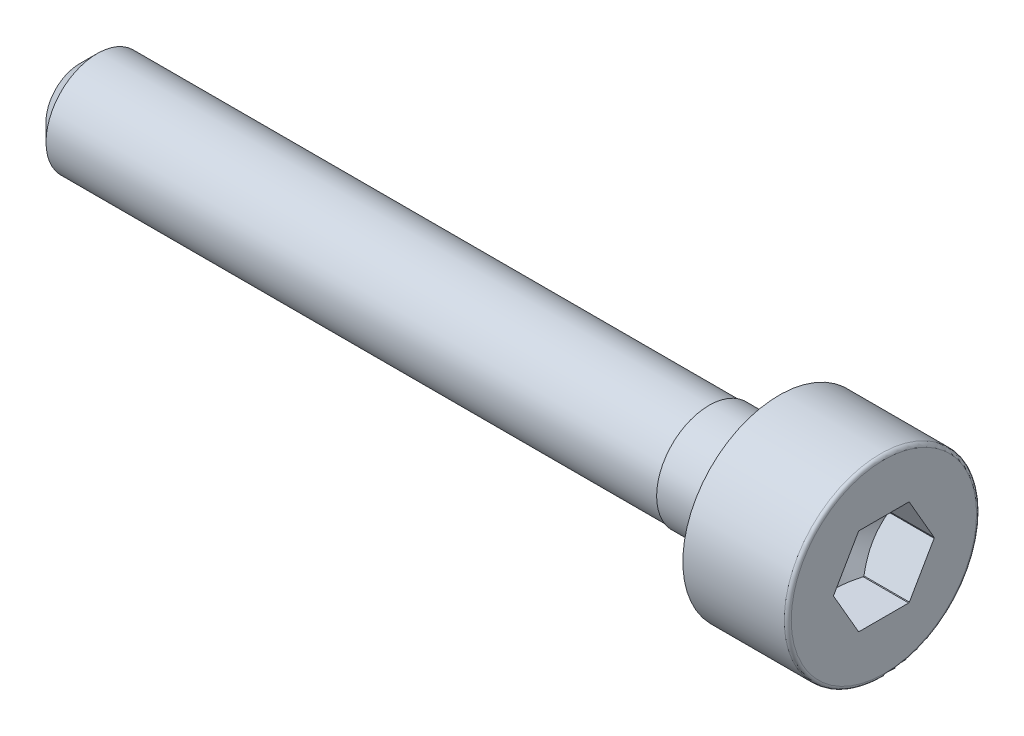
ISO-10303-21;
HEADER;
FILE_DESCRIPTION(('STEP AP214'),'2;1');
FILE_NAME('part.step','',(''),(''),'','','');
FILE_SCHEMA(('AUTOMOTIVE_DESIGN { 1 0 10303 214 1 1 1 1 }'));
ENDSEC;
DATA;
#1=APPLICATION_CONTEXT('core data for automotive mechanical design processes');
#2=APPLICATION_PROTOCOL_DEFINITION('international standard','automotive_design',2000,#1);
#3=PRODUCT_CONTEXT('',#1,'mechanical');
#4=PRODUCT('Part','Part','',(#3));
#5=PRODUCT_RELATED_PRODUCT_CATEGORY('part','',(#4));
#6=PRODUCT_DEFINITION_FORMATION('','',#4);
#7=PRODUCT_DEFINITION_CONTEXT('part definition',#1,'design');
#8=PRODUCT_DEFINITION('design','',#6,#7);
#9=PRODUCT_DEFINITION_SHAPE('','',#8);
#10=(LENGTH_UNIT() NAMED_UNIT(*) SI_UNIT(.MILLI.,.METRE.));
#11=(NAMED_UNIT(*) PLANE_ANGLE_UNIT() SI_UNIT($,.RADIAN.));
#12=(NAMED_UNIT(*) SI_UNIT($,.STERADIAN.) SOLID_ANGLE_UNIT());
#13=UNCERTAINTY_MEASURE_WITH_UNIT(LENGTH_MEASURE(1.E-05),#10,'distance_accuracy_value','');
#14=(GEOMETRIC_REPRESENTATION_CONTEXT(3) GLOBAL_UNCERTAINTY_ASSIGNED_CONTEXT((#13)) GLOBAL_UNIT_ASSIGNED_CONTEXT((#10,
#11,#12)) REPRESENTATION_CONTEXT('',''));
#15=CARTESIAN_POINT('',(0.,0.,0.));
#16=DIRECTION('',(0.,0.,1.));
#17=DIRECTION('',(1.,0.,0.));
#18=AXIS2_PLACEMENT_3D('',#15,#16,#17);
#19=CARTESIAN_POINT('',(0.872046109510001,0.,0.));
#20=DIRECTION('',(1.,0.,0.));
#21=DIRECTION('',(0.,0.,-1.));
#22=AXIS2_PLACEMENT_3D('',#19,#20,#21);
#23=PLANE('',#22);
#24=CARTESIAN_POINT('',(0.872046109520852,0.,0.));
#25=DIRECTION('',(1.,0.,0.));
#26=DIRECTION('',(0.,0.,-1.));
#27=AXIS2_PLACEMENT_3D('',#24,#25,#26);
#28=CIRCLE('',#27,0.0024417953457033);
#29=CARTESIAN_POINT('',(0.872046109520852,0.,-0.0024417953457033));
#30=VERTEX_POINT('',#29);
#31=EDGE_CURVE('E364',#30,#30,#28,.T.);
#32=ORIENTED_EDGE('',*,*,#31,.T.);
#33=EDGE_LOOP('',(#32));
#34=FACE_BOUND('',#33,.T.);
#35=ADVANCED_FACE('F55',(#34),#23,.T.);
#36=CARTESIAN_POINT('',(1.93531816915,0.,0.));
#37=DIRECTION('',(-1.,0.,0.));
#38=DIRECTION('',(0.,0.,1.));
#39=AXIS2_PLACEMENT_3D('',#36,#37,#38);
#40=CYLINDRICAL_SURFACE('',#39,1.4365);
#41=DIRECTION('',(1.,0.,0.));
#42=VECTOR('',#41,1.);
#43=CARTESIAN_POINT('',(3.,1.25,-0.707836315826));
#44=LINE('',#43,#42);
#45=CARTESIAN_POINT('',(1.70000000002484,1.25,-0.707836315866147));
#46=VERTEX_POINT('',#45);
#47=CARTESIAN_POINT('',(3.,1.25,-0.70783631582525));
#48=VERTEX_POINT('',#47);
#49=EDGE_CURVE('E137',#46,#48,#44,.T.);
#50=ORIENTED_EDGE('',*,*,#49,.F.);
#51=CARTESIAN_POINT('',(1.70000000002801,0.,0.));
#52=DIRECTION('',(1.,0.,0.));
#53=DIRECTION('',(0.,0.479425538601176,0.877582561892027));
#54=AXIS2_PLACEMENT_3D('',#51,#52,#53);
#55=CIRCLE('',#54,1.4365000000403);
#56=CARTESIAN_POINT('',(1.70000000002801,1.2380042312635,-0.728613596791762));
#57=VERTEX_POINT('',#56);
#58=EDGE_CURVE('E131',#46,#57,#55,.F.);
#59=ORIENTED_EDGE('',*,*,#58,.T.);
#60=DIRECTION('',(1.,0.,0.));
#61=VECTOR('',#60,1.);
#62=CARTESIAN_POINT('',(3.,1.23800423122701,-0.728613596812826));
#63=LINE('',#62,#61);
#64=CARTESIAN_POINT('',(3.,1.23800423122501,-0.728613596817435));
#65=VERTEX_POINT('',#64);
#66=EDGE_CURVE('E127',#65,#57,#63,.F.);
#67=ORIENTED_EDGE('',*,*,#66,.F.);
#68=CARTESIAN_POINT('',(3.,0.,0.));
#69=DIRECTION('',(1.,0.,0.));
#70=DIRECTION('',(0.,0.,-1.));
#71=AXIS2_PLACEMENT_3D('',#68,#69,#70);
#72=CIRCLE('',#71,1.4365);
#73=EDGE_CURVE('E110',#48,#65,#72,.F.);
#74=ORIENTED_EDGE('',*,*,#73,.F.);
#75=EDGE_LOOP('',(#50,#59,#67,#74));
#76=FACE_BOUND('',#75,.T.);
#77=ADVANCED_FACE('F128',(#76),#40,.F.);
#78=CARTESIAN_POINT('',(1.93531816915,0.,0.));
#79=DIRECTION('',(-1.,0.,0.));
#80=DIRECTION('',(0.,0.,1.));
#81=AXIS2_PLACEMENT_3D('',#78,#79,#80);
#82=CYLINDRICAL_SURFACE('',#81,1.4365);
#83=DIRECTION('',(1.,0.,0.));
#84=VECTOR('',#83,1.);
#85=CARTESIAN_POINT('',(3.,-0.011995768776154,-1.43644991264235));
#86=LINE('',#85,#84);
#87=CARTESIAN_POINT('',(3.,-0.0119957687730186,-1.43644991264259));
#88=VERTEX_POINT('',#87);
#89=CARTESIAN_POINT('',(1.70000000002801,-0.0119957687403476,-1.43644991266302));
#90=VERTEX_POINT('',#89);
#91=EDGE_CURVE('E241',#88,#90,#86,.F.);
#92=ORIENTED_EDGE('',*,*,#91,.F.);
#93=CARTESIAN_POINT('',(3.,0.,0.));
#94=DIRECTION('',(1.,0.,0.));
#95=DIRECTION('',(0.,0.,-1.));
#96=AXIS2_PLACEMENT_3D('',#93,#94,#95);
#97=CIRCLE('',#96,1.4365);
#98=CARTESIAN_POINT('',(3.,0.011995768771504,-1.43644991264127));
#99=VERTEX_POINT('',#98);
#100=EDGE_CURVE('E122',#99,#88,#97,.F.);
#101=ORIENTED_EDGE('',*,*,#100,.F.);
#102=DIRECTION('',(1.,0.,0.));
#103=VECTOR('',#102,1.);
#104=CARTESIAN_POINT('',(3.,0.0119957687731247,-1.4364499126397));
#105=LINE('',#104,#103);
#106=CARTESIAN_POINT('',(1.70000000002372,0.0119957687349687,-1.43644991266173));
#107=VERTEX_POINT('',#106);
#108=EDGE_CURVE('E142',#107,#99,#105,.T.);
#109=ORIENTED_EDGE('',*,*,#108,.F.);
#110=CARTESIAN_POINT('',(1.70000000002801,0.,0.));
#111=DIRECTION('',(1.,0.,0.));
#112=DIRECTION('',(0.,0.479425538601176,0.877582561892027));
#113=AXIS2_PLACEMENT_3D('',#110,#111,#112);
#114=CIRCLE('',#113,1.4365000000403);
#115=EDGE_CURVE('E157',#107,#90,#114,.F.);
#116=ORIENTED_EDGE('',*,*,#115,.T.);
#117=EDGE_LOOP('',(#92,#101,#109,#116));
#118=FACE_BOUND('',#117,.T.);
#119=ADVANCED_FACE('F459',(#118),#82,.F.);
#120=CARTESIAN_POINT('',(1.93531816915,0.,0.));
#121=DIRECTION('',(-1.,0.,0.));
#122=DIRECTION('',(0.,0.,1.));
#123=AXIS2_PLACEMENT_3D('',#120,#121,#122);
#124=CYLINDRICAL_SURFACE('',#123,1.4365);
#125=CARTESIAN_POINT('',(1.70000000002801,0.,0.));
#126=DIRECTION('',(1.,0.,0.));
#127=DIRECTION('',(0.,0.479425538601176,0.877582561892027));
#128=AXIS2_PLACEMENT_3D('',#125,#126,#127);
#129=CIRCLE('',#128,1.4365000000403);
#130=CARTESIAN_POINT('',(1.70000000002523,-1.23800423126249,-0.728613596796741));
#131=VERTEX_POINT('',#130);
#132=CARTESIAN_POINT('',(1.70000000002801,-1.25,-0.707836315865647));
#133=VERTEX_POINT('',#132);
#134=EDGE_CURVE('E167',#131,#133,#129,.F.);
#135=ORIENTED_EDGE('',*,*,#134,.T.);
#136=DIRECTION('',(1.,0.,0.));
#137=VECTOR('',#136,1.);
#138=CARTESIAN_POINT('',(3.,-1.25,-0.707836315825));
#139=LINE('',#138,#137);
#140=CARTESIAN_POINT('',(3.,-1.25,-0.70783631582475));
#141=VERTEX_POINT('',#140);
#142=EDGE_CURVE('E442',#141,#133,#139,.F.);
#143=ORIENTED_EDGE('',*,*,#142,.F.);
#144=CARTESIAN_POINT('',(3.,0.,0.));
#145=DIRECTION('',(1.,0.,0.));
#146=DIRECTION('',(0.,0.,-1.));
#147=AXIS2_PLACEMENT_3D('',#144,#145,#146);
#148=CIRCLE('',#147,1.4365);
#149=CARTESIAN_POINT('',(3.,-1.23800423122596,-0.728613596819084));
#150=VERTEX_POINT('',#149);
#151=EDGE_CURVE('E356',#150,#141,#148,.F.);
#152=ORIENTED_EDGE('',*,*,#151,.F.);
#153=DIRECTION('',(1.,0.,0.));
#154=VECTOR('',#153,1.);
#155=CARTESIAN_POINT('',(3.,-1.23800423122892,-0.728613596816125));
#156=LINE('',#155,#154);
#157=EDGE_CURVE('E240',#131,#150,#156,.T.);
#158=ORIENTED_EDGE('',*,*,#157,.F.);
#159=EDGE_LOOP('',(#135,#143,#152,#158));
#160=FACE_BOUND('',#159,.T.);
#161=ADVANCED_FACE('F464',(#160),#124,.F.);
#162=CARTESIAN_POINT('',(1.93531816915,0.,0.));
#163=DIRECTION('',(-1.,0.,0.));
#164=DIRECTION('',(0.,0.,1.));
#165=AXIS2_PLACEMENT_3D('',#162,#163,#164);
#166=CYLINDRICAL_SURFACE('',#165,1.4365);
#167=DIRECTION('',(1.,0.,0.));
#168=VECTOR('',#167,1.);
#169=CARTESIAN_POINT('',(3.,-1.25,0.707836315824));
#170=LINE('',#169,#168);
#171=CARTESIAN_POINT('',(1.70000000002455,-1.25,0.707836315865147));
#172=VERTEX_POINT('',#171);
#173=CARTESIAN_POINT('',(3.,-1.25,0.70783631582425));
#174=VERTEX_POINT('',#173);
#175=EDGE_CURVE('E437',#172,#174,#170,.T.);
#176=ORIENTED_EDGE('',*,*,#175,.F.);
#177=CARTESIAN_POINT('',(1.70000000002801,0.,0.));
#178=DIRECTION('',(1.,0.,0.));
#179=DIRECTION('',(0.,0.479425538601176,0.877582561892027));
#180=AXIS2_PLACEMENT_3D('',#177,#178,#179);
#181=CIRCLE('',#180,1.4365000000403);
#182=CARTESIAN_POINT('',(1.70000000002801,-1.2380042312635,0.728613596791762));
#183=VERTEX_POINT('',#182);
#184=EDGE_CURVE('E171',#172,#183,#181,.F.);
#185=ORIENTED_EDGE('',*,*,#184,.T.);
#186=DIRECTION('',(1.,0.,0.));
#187=VECTOR('',#186,1.);
#188=CARTESIAN_POINT('',(3.,-1.23800423122701,0.728613596812826));
#189=LINE('',#188,#187);
#190=CARTESIAN_POINT('',(3.,-1.23800423122501,0.728613596817435));
#191=VERTEX_POINT('',#190);
#192=EDGE_CURVE('E286',#191,#183,#189,.F.);
#193=ORIENTED_EDGE('',*,*,#192,.F.);
#194=CARTESIAN_POINT('',(3.,0.,0.));
#195=DIRECTION('',(1.,0.,0.));
#196=DIRECTION('',(0.,0.,-1.));
#197=AXIS2_PLACEMENT_3D('',#194,#195,#196);
#198=CIRCLE('',#197,1.4365);
#199=EDGE_CURVE('E359',#174,#191,#198,.F.);
#200=ORIENTED_EDGE('',*,*,#199,.F.);
#201=EDGE_LOOP('',(#176,#185,#193,#200));
#202=FACE_BOUND('',#201,.T.);
#203=ADVANCED_FACE('F471',(#202),#166,.F.);
#204=CARTESIAN_POINT('',(1.93531816915,0.,0.));
#205=DIRECTION('',(-1.,0.,0.));
#206=DIRECTION('',(0.,0.,1.));
#207=AXIS2_PLACEMENT_3D('',#204,#205,#206);
#208=CYLINDRICAL_SURFACE('',#207,1.4365);
#209=DIRECTION('',(1.,0.,0.));
#210=VECTOR('',#209,1.);
#211=CARTESIAN_POINT('',(3.,0.011995768776154,1.43644991264235));
#212=LINE('',#211,#210);
#213=CARTESIAN_POINT('',(3.,0.0119957687730186,1.43644991264259));
#214=VERTEX_POINT('',#213);
#215=CARTESIAN_POINT('',(1.70000000002801,0.0119957687403476,1.43644991266302));
#216=VERTEX_POINT('',#215);
#217=EDGE_CURVE('E423',#214,#216,#212,.F.);
#218=ORIENTED_EDGE('',*,*,#217,.F.);
#219=CARTESIAN_POINT('',(3.,0.,0.));
#220=DIRECTION('',(1.,0.,0.));
#221=DIRECTION('',(0.,0.,-1.));
#222=AXIS2_PLACEMENT_3D('',#219,#220,#221);
#223=CIRCLE('',#222,1.4365);
#224=CARTESIAN_POINT('',(3.,-0.011995768771504,1.43644991264127));
#225=VERTEX_POINT('',#224);
#226=EDGE_CURVE('E172',#225,#214,#223,.F.);
#227=ORIENTED_EDGE('',*,*,#226,.F.);
#228=DIRECTION('',(1.,0.,0.));
#229=VECTOR('',#228,1.);
#230=CARTESIAN_POINT('',(3.,-0.0119957687731247,1.4364499126397));
#231=LINE('',#230,#229);
#232=CARTESIAN_POINT('',(1.70000000002372,-0.0119957687349687,1.43644991266173));
#233=VERTEX_POINT('',#232);
#234=EDGE_CURVE('E285',#233,#225,#231,.T.);
#235=ORIENTED_EDGE('',*,*,#234,.F.);
#236=CARTESIAN_POINT('',(1.70000000002801,0.,0.));
#237=DIRECTION('',(1.,0.,0.));
#238=DIRECTION('',(0.,0.479425538601176,0.877582561892027));
#239=AXIS2_PLACEMENT_3D('',#236,#237,#238);
#240=CIRCLE('',#239,1.4365000000403);
#241=EDGE_CURVE('E179',#233,#216,#240,.F.);
#242=ORIENTED_EDGE('',*,*,#241,.T.);
#243=EDGE_LOOP('',(#218,#227,#235,#242));
#244=FACE_BOUND('',#243,.T.);
#245=ADVANCED_FACE('F262',(#244),#208,.F.);
#246=CARTESIAN_POINT('',(1.69999999997117,0.,0.));
#247=DIRECTION('',(1.,0.,0.));
#248=DIRECTION('',(0.,0.,-1.));
#249=AXIS2_PLACEMENT_3D('',#246,#247,#248);
#250=CONICAL_SURFACE('',#249,1.43649999991328,1.04719755119156);
#251=ORIENTED_EDGE('',*,*,#31,.F.);
#252=EDGE_LOOP('',(#251));
#253=FACE_BOUND('',#252,.T.);
#254=CARTESIAN_POINT('',(1.70000000002131,-0.0119957687751554,-1.43644991264292));
#255=CARTESIAN_POINT('',(1.68414588138979,-0.0602530827740917,-1.40858853941525));
#256=CARTESIAN_POINT('',(1.66959339963717,-0.108865929624587,-1.38052189920003));
#257=CARTESIAN_POINT('',(1.64371708560586,-0.206826058298963,-1.32396459254));
#258=CARTESIAN_POINT('',(1.63239957889383,-0.256174583166221,-1.29547320842377));
#259=CARTESIAN_POINT('',(1.61388761331228,-0.354368017399713,-1.23878120273638));
#260=CARTESIAN_POINT('',(1.60660927936993,-0.403200737073938,-1.21058761888719));
#261=CARTESIAN_POINT('',(1.59631615482563,-0.501162504689917,-1.15402936598378));
#262=CARTESIAN_POINT('',(1.59329741225864,-0.550291235433497,-1.12566488006402));
#263=CARTESIAN_POINT('',(1.59168762776646,-0.652763970514573,-1.06650221888033));
#264=CARTESIAN_POINT('',(1.59349265517208,-0.70611306415141,-1.03570110530806));
#265=CARTESIAN_POINT('',(1.60222572912036,-0.812546061317089,-0.974251985743768));
#266=CARTESIAN_POINT('',(1.60915940909837,-0.865629608562112,-0.943604185452299));
#267=CARTESIAN_POINT('',(1.62778568704977,-0.97244576363142,-0.881933849569202));
#268=CARTESIAN_POINT('',(1.63958816399312,-1.02616351886647,-0.850919889123968));
#269=CARTESIAN_POINT('',(1.66708663744431,-1.13273062883919,-0.789393339494428));
#270=CARTESIAN_POINT('',(1.68277408069282,-1.18558162289588,-0.758879803848841));
#271=CARTESIAN_POINT('',(1.70000000002247,-1.23800423122898,-0.728613596816087));
#272=B_SPLINE_CURVE_WITH_KNOTS('',3,(#254,#255,#256,#257,#258,#259,#260,#261,#262,#263,#264,
#265,#266,#267,#268,#269,#270,#271),.UNSPECIFIED.,.F.,.F.,(4,2,2,2,2,2,2,2,4),(0.,
0.173845484445308,0.348028611041785,0.518444706864547,0.688702589796571,0.873360160496576,
1.05822086528754,1.24750397554291,1.43637400256418),.UNSPECIFIED.);
#273=EDGE_CURVE('E229',#90,#131,#272,.T.);
#274=ORIENTED_EDGE('',*,*,#273,.F.);
#275=ORIENTED_EDGE('',*,*,#115,.F.);
#276=CARTESIAN_POINT('',(1.7000000000207,1.23800423122751,-0.728613596812537));
#277=CARTESIAN_POINT('',(1.68201352964352,1.18327512026783,-0.760211463757636));
#278=CARTESIAN_POINT('',(1.66570603852886,1.128073288678,-0.792082256085801));
#279=CARTESIAN_POINT('',(1.63735677647757,1.01673056995744,-0.856366004711452));
#280=CARTESIAN_POINT('',(1.62532483223944,0.960587826194926,-0.888780032935801));
#281=CARTESIAN_POINT('',(1.60675342622048,0.848992255018161,-0.953209765995109));
#282=CARTESIAN_POINT('',(1.60008770170949,0.793555772913711,-0.985216033861055));
#283=CARTESIAN_POINT('',(1.59240312262187,0.682445932830085,-1.04936532994299));
#284=CARTESIAN_POINT('',(1.5913776125683,0.626772931649001,-1.0815081521615));
#285=CARTESIAN_POINT('',(1.59476416336116,0.524338028994538,-1.14064897078349));
#286=CARTESIAN_POINT('',(1.59834525605539,0.477553650490444,-1.16765994430671));
#287=CARTESIAN_POINT('',(1.60931646482189,0.384286759360034,-1.22150760900736));
#288=CARTESIAN_POINT('',(1.61670971975658,0.337804527501618,-1.24834413808337));
#289=CARTESIAN_POINT('',(1.63504283382563,0.244372682731174,-1.30228703881249));
#290=CARTESIAN_POINT('',(1.64605410663709,0.197433843328689,-1.32938719037698));
#291=CARTESIAN_POINT('',(1.6709871409355,0.104222955123591,-1.38320252177363));
#292=CARTESIAN_POINT('',(1.68490370528612,0.0579498712773238,-1.40991829918852));
#293=CARTESIAN_POINT('',(1.7000000000199,0.0119957687717034,-1.43644991264052));
#294=B_SPLINE_CURVE_WITH_KNOTS('',3,(#276,#277,#278,#279,#280,#281,#282,#283,#284,#285,#286,
#287,#288,#289,#290,#291,#292,#293),.UNSPECIFIED.,.F.,.F.,(4,2,2,2,2,2,2,2,4),(0.,
0.197193050670564,0.394836432251318,0.587681100636177,0.780298162595088,0.942578421652692,
1.10499251308909,1.27082710933431,1.43636755570493),.UNSPECIFIED.);
#295=EDGE_CURVE('E136',#57,#107,#294,.T.);
#296=ORIENTED_EDGE('',*,*,#295,.F.);
#297=ORIENTED_EDGE('',*,*,#58,.F.);
#298=CARTESIAN_POINT('',(1.70000000001604,1.25000000000585,0.707836315819655));
#299=CARTESIAN_POINT('',(1.68201352964148,1.2500000000021,0.644640581929249));
#300=CARTESIAN_POINT('',(1.66570603852809,1.25000000000056,0.580898997273059));
#301=CARTESIAN_POINT('',(1.63735677647815,1.24999999999944,0.452331500022328));
#302=CARTESIAN_POINT('',(1.62532483224009,1.24999999999985,0.38750344357406));
#303=CARTESIAN_POINT('',(1.60675342622154,1.25000000000015,0.258643977456162));
#304=CARTESIAN_POINT('',(1.60008770171089,1.25000000000004,0.194631441724558));
#305=CARTESIAN_POINT('',(1.59240312262381,1.24999999999996,0.0663328495613335));
#306=CARTESIAN_POINT('',(1.59137761257044,1.24999999999999,0.00204720512466118));
#307=CARTESIAN_POINT('',(1.5947641633636,1.25000000000001,-0.116234432118472));
#308=CARTESIAN_POINT('',(1.59834525605794,1.25,-0.170256379164402));
#309=CARTESIAN_POINT('',(1.60931646482454,1.25,-0.277951708564682));
#310=CARTESIAN_POINT('',(1.61670971975925,1.25,-0.331624766716186));
#311=CARTESIAN_POINT('',(1.63504283382822,1.25,-0.439510568173373));
#312=CARTESIAN_POINT('',(1.6460541066396,1.25,-0.493710871301787));
#313=CARTESIAN_POINT('',(1.67098714093777,1.25,-0.601341534093964));
#314=CARTESIAN_POINT('',(1.68490370528824,1.25,-0.654773088923192));
#315=CARTESIAN_POINT('',(1.70000000002185,1.25,-0.707836315826651));
#316=B_SPLINE_CURVE_WITH_KNOTS('',3,(#298,#299,#300,#301,#302,#303,#304,#305,#306,#307,#308,
#309,#310,#311,#312,#313,#314,#315),.UNSPECIFIED.,.F.,.F.,(4,2,2,2,2,2,2,2,4),(0.,
0.197193050669286,0.394836432248857,0.587681100632796,0.780298162590748,0.9425784216469,
1.10499251308187,1.27082710932545,1.43636755569442),.UNSPECIFIED.);
#317=CARTESIAN_POINT('',(1.70000000000979,1.25,0.707836315821826));
#318=VERTEX_POINT('',#317);
#319=EDGE_CURVE('E268',#318,#46,#316,.T.);
#320=ORIENTED_EDGE('',*,*,#319,.F.);
#321=CARTESIAN_POINT('',(1.7,0.,0.));
#322=DIRECTION('',(-1.,0.,0.));
#323=DIRECTION('',(0.,0.,1.));
#324=AXIS2_PLACEMENT_3D('',#321,#322,#323);
#325=CIRCLE('',#324,1.4365);
#326=CARTESIAN_POINT('',(1.70000000001122,1.23800423122707,0.72861359681719));
#327=VERTEX_POINT('',#326);
#328=EDGE_CURVE('E192',#318,#327,#325,.F.);
#329=ORIENTED_EDGE('',*,*,#328,.T.);
#330=CARTESIAN_POINT('',(1.70000000002131,0.0119957687751552,1.43644991264292));
#331=CARTESIAN_POINT('',(1.68414588138961,0.0602530827746514,1.40858853941493));
#332=CARTESIAN_POINT('',(1.66959339963683,0.108865929625716,1.38052189919938));
#333=CARTESIAN_POINT('',(1.6437170856053,0.206826058301247,1.32396459253868));
#334=CARTESIAN_POINT('',(1.63239957889319,0.256174583169091,1.29547320842211));
#335=CARTESIAN_POINT('',(1.61388761331161,0.354368017403743,1.23878120273405));
#336=CARTESIAN_POINT('',(1.6066092793693,0.403200737078542,1.21058761888453));
#337=CARTESIAN_POINT('',(1.59631615482517,0.501162504695667,1.15402936598046));
#338=CARTESIAN_POINT('',(1.59329741225833,0.55029123543982,1.12566488006037));
#339=CARTESIAN_POINT('',(1.59168762776659,0.652763970520512,1.0665022188769));
#340=CARTESIAN_POINT('',(1.59349265517236,0.70611306415639,1.03570110530519));
#341=CARTESIAN_POINT('',(1.60222572912074,0.812546061320152,0.974251985742));
#342=CARTESIAN_POINT('',(1.6091594090987,0.865629608564216,0.943604185451084));
#343=CARTESIAN_POINT('',(1.62778568704983,0.97244576363158,0.88193384956911));
#344=CARTESIAN_POINT('',(1.63958816399295,1.02616351886564,0.850919889124445));
#345=CARTESIAN_POINT('',(1.66708663744355,1.13273062883643,0.789393339496022));
#346=CARTESIAN_POINT('',(1.6827740806917,1.18558162289217,0.758879803850984));
#347=CARTESIAN_POINT('',(1.70000000002094,1.23800423122434,0.728613596818769));
#348=B_SPLINE_CURVE_WITH_KNOTS('',3,(#330,#331,#332,#333,#334,#335,#336,#337,#338,#339,#340,
#341,#342,#343,#344,#345,#346,#347),.UNSPECIFIED.,.F.,.F.,(4,2,2,2,2,2,2,2,4),(0.,
0.173845484447327,0.348028611045833,0.518444706870547,0.688702589804519,0.873360160501231,
1.05822086528889,1.24750397554079,1.43637400255861),.UNSPECIFIED.);
#349=EDGE_CURVE('E214',#216,#327,#348,.T.);
#350=ORIENTED_EDGE('',*,*,#349,.F.);
#351=ORIENTED_EDGE('',*,*,#241,.F.);
#352=CARTESIAN_POINT('',(1.7000000000207,-1.23800423122751,0.728613596812537));
#353=CARTESIAN_POINT('',(1.68201352964352,-1.18327512026783,0.760211463757636));
#354=CARTESIAN_POINT('',(1.66570603852886,-1.128073288678,0.792082256085801));
#355=CARTESIAN_POINT('',(1.63735677647757,-1.01673056995744,0.856366004711452));
#356=CARTESIAN_POINT('',(1.62532483223944,-0.960587826194926,0.888780032935801));
#357=CARTESIAN_POINT('',(1.60675342622048,-0.848992255018161,0.953209765995109));
#358=CARTESIAN_POINT('',(1.60008770170949,-0.793555772913711,0.985216033861055));
#359=CARTESIAN_POINT('',(1.59240312262187,-0.682445932830085,1.04936532994299));
#360=CARTESIAN_POINT('',(1.5913776125683,-0.626772931649001,1.0815081521615));
#361=CARTESIAN_POINT('',(1.59476416336116,-0.524338028994538,1.14064897078349));
#362=CARTESIAN_POINT('',(1.59834525605539,-0.477553650490444,1.16765994430671));
#363=CARTESIAN_POINT('',(1.60931646482189,-0.384286759360034,1.22150760900736));
#364=CARTESIAN_POINT('',(1.61670971975658,-0.337804527501618,1.24834413808337));
#365=CARTESIAN_POINT('',(1.63504283382563,-0.244372682731174,1.30228703881249));
#366=CARTESIAN_POINT('',(1.64605410663709,-0.197433843328689,1.32938719037698));
#367=CARTESIAN_POINT('',(1.6709871409355,-0.104222955123591,1.38320252177363));
#368=CARTESIAN_POINT('',(1.68490370528612,-0.057949871277324,1.40991829918852));
#369=CARTESIAN_POINT('',(1.7000000000199,-0.0119957687717035,1.43644991264052));
#370=B_SPLINE_CURVE_WITH_KNOTS('',3,(#352,#353,#354,#355,#356,#357,#358,#359,#360,#361,#362,
#363,#364,#365,#366,#367,#368,#369),.UNSPECIFIED.,.F.,.F.,(4,2,2,2,2,2,2,2,4),(0.,
0.197193050670564,0.394836432251318,0.587681100636177,0.780298162595088,0.942578421652692,
1.10499251308909,1.27082710933431,1.43636755570493),.UNSPECIFIED.);
#371=EDGE_CURVE('E276',#183,#233,#370,.T.);
#372=ORIENTED_EDGE('',*,*,#371,.F.);
#373=ORIENTED_EDGE('',*,*,#184,.F.);
#374=CARTESIAN_POINT('',(1.70000000002185,-1.25,-0.707836315826651));
#375=CARTESIAN_POINT('',(1.68201352964472,-1.25,-0.644640581936366));
#376=CARTESIAN_POINT('',(1.66570603853013,-1.25,-0.580898997279948));
#377=CARTESIAN_POINT('',(1.637356776479,-1.25,-0.452331500028476));
#378=CARTESIAN_POINT('',(1.62532483224095,-1.25,-0.387503443579696));
#379=CARTESIAN_POINT('',(1.60675342622218,-1.25,-0.258643977460913));
#380=CARTESIAN_POINT('',(1.6000877017113,-1.25,-0.194631441728938));
#381=CARTESIAN_POINT('',(1.59240312262388,-1.25,-0.0663328495649193));
#382=CARTESIAN_POINT('',(1.59137761257042,-1.25,-0.0020472051278254));
#383=CARTESIAN_POINT('',(1.59476416336346,-1.25,0.116234432115793));
#384=CARTESIAN_POINT('',(1.59834525605773,-1.25,0.170256379161788));
#385=CARTESIAN_POINT('',(1.60931646482422,-1.25,0.277951708562193));
#386=CARTESIAN_POINT('',(1.61670971975888,-1.25,0.331624766713757));
#387=CARTESIAN_POINT('',(1.63504283382779,-1.25,0.439510568171105));
#388=CARTESIAN_POINT('',(1.64605410663913,-1.25,0.49371087129962));
#389=CARTESIAN_POINT('',(1.67098714093728,-1.25,0.601341534092007));
#390=CARTESIAN_POINT('',(1.68490370528774,-1.25,0.654773088921346));
#391=CARTESIAN_POINT('',(1.70000000002135,-1.25,0.707836315824913));
#392=B_SPLINE_CURVE_WITH_KNOTS('',3,(#374,#375,#376,#377,#378,#379,#380,#381,#382,#383,#384,
#385,#386,#387,#388,#389,#390,#391),.UNSPECIFIED.,.F.,.F.,(4,2,2,2,2,2,2,2,4),(0.,
0.197193050670838,0.39483643225186,0.587681100637009,0.780298162596212,0.942578421652547,
1.10499251308767,1.27082710933154,1.43636755570082),.UNSPECIFIED.);
#393=EDGE_CURVE('E242',#133,#172,#392,.T.);
#394=ORIENTED_EDGE('',*,*,#393,.F.);
#395=ORIENTED_EDGE('',*,*,#134,.F.);
#396=EDGE_LOOP('',(#274,#275,#296,#297,#320,#329,#350,#351,#372,#373,#394,#395));
#397=FACE_BOUND('',#396,.T.);
#398=ADVANCED_FACE('F256',(#253,#397),#250,.F.);
#399=CARTESIAN_POINT('',(1.93531816915,0.,0.));
#400=DIRECTION('',(-1.,0.,0.));
#401=DIRECTION('',(0.,0.,1.));
#402=AXIS2_PLACEMENT_3D('',#399,#400,#401);
#403=CYLINDRICAL_SURFACE('',#402,1.4365);
#404=ORIENTED_EDGE('',*,*,#328,.F.);
#405=DIRECTION('',(1.,0.,0.));
#406=VECTOR('',#405,1.);
#407=CARTESIAN_POINT('',(3.,1.25,0.707836315825));
#408=LINE('',#407,#406);
#409=CARTESIAN_POINT('',(3.,1.25,0.70783631582475));
#410=VERTEX_POINT('',#409);
#411=EDGE_CURVE('E376',#410,#318,#408,.F.);
#412=ORIENTED_EDGE('',*,*,#411,.F.);
#413=CARTESIAN_POINT('',(3.,0.,0.));
#414=DIRECTION('',(1.,0.,0.));
#415=DIRECTION('',(0.,0.,-1.));
#416=AXIS2_PLACEMENT_3D('',#413,#414,#415);
#417=CIRCLE('',#416,1.4365);
#418=CARTESIAN_POINT('',(3.,1.23800423122596,0.728613596819084));
#419=VERTEX_POINT('',#418);
#420=EDGE_CURVE('E73',#419,#410,#417,.F.);
#421=ORIENTED_EDGE('',*,*,#420,.F.);
#422=DIRECTION('',(1.,0.,0.));
#423=VECTOR('',#422,1.);
#424=CARTESIAN_POINT('',(3.,1.23800423122892,0.728613596816125));
#425=LINE('',#424,#423);
#426=EDGE_CURVE('E152',#327,#419,#425,.T.);
#427=ORIENTED_EDGE('',*,*,#426,.F.);
#428=EDGE_LOOP('',(#404,#412,#421,#427));
#429=FACE_BOUND('',#428,.T.);
#430=ADVANCED_FACE('F261',(#429),#403,.F.);
#431=CARTESIAN_POINT('',(3.,1.25,-0.721687836487));
#432=DIRECTION('',(0.,-1.,0.));
#433=DIRECTION('',(0.,0.,-1.));
#434=AXIS2_PLACEMENT_3D('',#431,#432,#433);
#435=PLANE('',#434);
#436=ORIENTED_EDGE('',*,*,#319,.T.);
#437=ORIENTED_EDGE('',*,*,#49,.T.);
#438=DIRECTION('',(0.,0.,-1.));
#439=VECTOR('',#438,1.);
#440=CARTESIAN_POINT('',(3.,1.25,0.));
#441=LINE('',#440,#439);
#442=EDGE_CURVE('E120',#410,#48,#441,.T.);
#443=ORIENTED_EDGE('',*,*,#442,.F.);
#444=ORIENTED_EDGE('',*,*,#411,.T.);
#445=EDGE_LOOP('',(#436,#437,#443,#444));
#446=FACE_BOUND('',#445,.T.);
#447=ADVANCED_FACE('F394',(#446),#435,.T.);
#448=CARTESIAN_POINT('',(3.,0.,-1.44337567297));
#449=DIRECTION('',(0.,-0.50000000000019,0.866025403784329));
#450=DIRECTION('',(0.,-0.866025403784329,-0.50000000000019));
#451=AXIS2_PLACEMENT_3D('',#448,#449,#450);
#452=PLANE('',#451);
#453=ORIENTED_EDGE('',*,*,#295,.T.);
#454=ORIENTED_EDGE('',*,*,#108,.T.);
#455=DIRECTION('',(0.,-0.86602540378605,-0.499999999997209));
#456=VECTOR('',#455,1.);
#457=CARTESIAN_POINT('',(3.,1.23800423123,-0.728613596818));
#458=LINE('',#457,#456);
#459=EDGE_CURVE('E118',#65,#99,#458,.T.);
#460=ORIENTED_EDGE('',*,*,#459,.F.);
#461=ORIENTED_EDGE('',*,*,#66,.T.);
#462=EDGE_LOOP('',(#453,#454,#460,#461));
#463=FACE_BOUND('',#462,.T.);
#464=ADVANCED_FACE('F140',(#463),#452,.T.);
#465=CARTESIAN_POINT('',(3.,-1.25,-0.721687836487));
#466=DIRECTION('',(0.,0.50000000000019,0.866025403784329));
#467=DIRECTION('',(0.,-0.866025403784329,0.50000000000019));
#468=AXIS2_PLACEMENT_3D('',#465,#466,#467);
#469=PLANE('',#468);
#470=ORIENTED_EDGE('',*,*,#273,.T.);
#471=ORIENTED_EDGE('',*,*,#157,.T.);
#472=DIRECTION('',(0.,-0.86602540378605,0.499999999997209));
#473=VECTOR('',#472,1.);
#474=CARTESIAN_POINT('',(3.,-0.0119957687748,-1.43644991264));
#475=LINE('',#474,#473);
#476=EDGE_CURVE('E144',#88,#150,#475,.T.);
#477=ORIENTED_EDGE('',*,*,#476,.F.);
#478=ORIENTED_EDGE('',*,*,#91,.T.);
#479=EDGE_LOOP('',(#470,#471,#477,#478));
#480=FACE_BOUND('',#479,.T.);
#481=ADVANCED_FACE('F254',(#480),#469,.T.);
#482=CARTESIAN_POINT('',(3.,-1.25,0.721687836487));
#483=DIRECTION('',(0.,1.,0.));
#484=DIRECTION('',(0.,0.,1.));
#485=AXIS2_PLACEMENT_3D('',#482,#483,#484);
#486=PLANE('',#485);
#487=ORIENTED_EDGE('',*,*,#393,.T.);
#488=ORIENTED_EDGE('',*,*,#175,.T.);
#489=DIRECTION('',(0.,0.,-1.));
#490=VECTOR('',#489,1.);
#491=CARTESIAN_POINT('',(3.,-1.25,0.));
#492=LINE('',#491,#490);
#493=EDGE_CURVE('E150',#141,#174,#492,.F.);
#494=ORIENTED_EDGE('',*,*,#493,.F.);
#495=ORIENTED_EDGE('',*,*,#142,.T.);
#496=EDGE_LOOP('',(#487,#488,#494,#495));
#497=FACE_BOUND('',#496,.T.);
#498=ADVANCED_FACE('F291',(#497),#486,.T.);
#499=CARTESIAN_POINT('',(3.,0.,1.44337567297));
#500=DIRECTION('',(0.,0.50000000000019,-0.866025403784329));
#501=DIRECTION('',(0.,0.866025403784329,0.50000000000019));
#502=AXIS2_PLACEMENT_3D('',#499,#500,#501);
#503=PLANE('',#502);
#504=ORIENTED_EDGE('',*,*,#371,.T.);
#505=ORIENTED_EDGE('',*,*,#234,.T.);
#506=DIRECTION('',(0.,0.86602540378605,0.499999999997209));
#507=VECTOR('',#506,1.);
#508=CARTESIAN_POINT('',(3.,-1.23800423123,0.728613596818));
#509=LINE('',#508,#507);
#510=EDGE_CURVE('E176',#191,#225,#509,.T.);
#511=ORIENTED_EDGE('',*,*,#510,.F.);
#512=ORIENTED_EDGE('',*,*,#192,.T.);
#513=EDGE_LOOP('',(#504,#505,#511,#512));
#514=FACE_BOUND('',#513,.T.);
#515=ADVANCED_FACE('F287',(#514),#503,.T.);
#516=CARTESIAN_POINT('',(3.,1.25,0.721687836487));
#517=DIRECTION('',(0.,-0.50000000000019,-0.866025403784329));
#518=DIRECTION('',(0.,0.866025403784329,-0.50000000000019));
#519=AXIS2_PLACEMENT_3D('',#516,#517,#518);
#520=PLANE('',#519);
#521=ORIENTED_EDGE('',*,*,#349,.T.);
#522=ORIENTED_EDGE('',*,*,#426,.T.);
#523=DIRECTION('',(0.,0.86602540378605,-0.499999999997209));
#524=VECTOR('',#523,1.);
#525=CARTESIAN_POINT('',(3.,0.0119957687748,1.43644991264));
#526=LINE('',#525,#524);
#527=EDGE_CURVE('E184',#214,#419,#526,.T.);
#528=ORIENTED_EDGE('',*,*,#527,.F.);
#529=ORIENTED_EDGE('',*,*,#217,.T.);
#530=EDGE_LOOP('',(#521,#522,#528,#529));
#531=FACE_BOUND('',#530,.T.);
#532=ADVANCED_FACE('F290',(#531),#520,.T.);
#533=CARTESIAN_POINT('',(3.,0.,0.));
#534=DIRECTION('',(1.,0.,0.));
#535=DIRECTION('',(0.,0.,-1.));
#536=AXIS2_PLACEMENT_3D('',#533,#534,#535);
#537=PLANE('',#536);
#538=CARTESIAN_POINT('',(3.,0.,0.));
#539=DIRECTION('',(1.,0.,0.));
#540=DIRECTION('',(0.,0.,-1.));
#541=AXIS2_PLACEMENT_3D('',#538,#539,#540);
#542=CIRCLE('',#541,2.65);
#543=CARTESIAN_POINT('',(3.,0.,-2.65));
#544=VERTEX_POINT('',#543);
#545=EDGE_CURVE('E13',#544,#544,#542,.T.);
#546=ORIENTED_EDGE('',*,*,#545,.T.);
#547=EDGE_LOOP('',(#546));
#548=FACE_BOUND('',#547,.T.);
#549=ORIENTED_EDGE('',*,*,#527,.T.);
#550=ORIENTED_EDGE('',*,*,#420,.T.);
#551=ORIENTED_EDGE('',*,*,#442,.T.);
#552=ORIENTED_EDGE('',*,*,#73,.T.);
#553=ORIENTED_EDGE('',*,*,#459,.T.);
#554=ORIENTED_EDGE('',*,*,#100,.T.);
#555=ORIENTED_EDGE('',*,*,#476,.T.);
#556=ORIENTED_EDGE('',*,*,#151,.T.);
#557=ORIENTED_EDGE('',*,*,#493,.T.);
#558=ORIENTED_EDGE('',*,*,#199,.T.);
#559=ORIENTED_EDGE('',*,*,#510,.T.);
#560=ORIENTED_EDGE('',*,*,#226,.T.);
#561=EDGE_LOOP('',(#549,#550,#551,#552,#553,#554,#555,#556,#557,#558,#559,#560));
#562=FACE_BOUND('',#561,.T.);
#563=ADVANCED_FACE('F116',(#548,#562),#537,.T.);
#564=CARTESIAN_POINT('',(1.5,0.,0.));
#565=DIRECTION('',(1.,0.,0.));
#566=DIRECTION('',(0.,0.,-1.));
#567=AXIS2_PLACEMENT_3D('',#564,#565,#566);
#568=CYLINDRICAL_SURFACE('',#567,2.75);
#569=CARTESIAN_POINT('',(2.9,0.,0.));
#570=DIRECTION('',(1.,0.,0.));
#571=DIRECTION('',(0.,0.,-1.));
#572=AXIS2_PLACEMENT_3D('',#569,#570,#571);
#573=CIRCLE('',#572,2.75);
#574=CARTESIAN_POINT('',(2.9,0.,-2.75));
#575=VERTEX_POINT('',#574);
#576=EDGE_CURVE('E65',#575,#575,#573,.F.);
#577=ORIENTED_EDGE('',*,*,#576,.T.);
#578=EDGE_LOOP('',(#577));
#579=FACE_BOUND('',#578,.T.);
#580=CARTESIAN_POINT('',(0.,0.,0.));
#581=DIRECTION('',(1.,0.,0.));
#582=DIRECTION('',(0.,0.,-1.));
#583=AXIS2_PLACEMENT_3D('',#580,#581,#582);
#584=CIRCLE('',#583,2.75);
#585=CARTESIAN_POINT('',(0.,0.,-2.75));
#586=VERTEX_POINT('',#585);
#587=EDGE_CURVE('E191',#586,#586,#584,.T.);
#588=ORIENTED_EDGE('',*,*,#587,.T.);
#589=EDGE_LOOP('',(#588));
#590=FACE_BOUND('',#589,.T.);
#591=ADVANCED_FACE('F307',(#579,#590),#568,.T.);
#592=CARTESIAN_POINT('',(0.,0.,0.));
#593=DIRECTION('',(1.,0.,0.));
#594=DIRECTION('',(0.,0.,-1.));
#595=AXIS2_PLACEMENT_3D('',#592,#593,#594);
#596=PLANE('',#595);
#597=CARTESIAN_POINT('',(0.,0.,0.));
#598=DIRECTION('',(1.,0.,0.));
#599=DIRECTION('',(0.,0.,-1.));
#600=AXIS2_PLACEMENT_3D('',#597,#598,#599);
#601=CIRCLE('',#600,1.6);
#602=CARTESIAN_POINT('',(0.,0.,-1.6));
#603=VERTEX_POINT('',#602);
#604=EDGE_CURVE('E338',#603,#603,#601,.T.);
#605=ORIENTED_EDGE('',*,*,#604,.T.);
#606=EDGE_LOOP('',(#605));
#607=FACE_BOUND('',#606,.T.);
#608=ORIENTED_EDGE('',*,*,#587,.F.);
#609=EDGE_LOOP('',(#608));
#610=FACE_BOUND('',#609,.T.);
#611=ADVANCED_FACE('F304',(#607,#610),#596,.F.);
#612=CARTESIAN_POINT('',(-2.,0.,0.));
#613=DIRECTION('',(1.,0.,0.));
#614=DIRECTION('',(0.,0.,-1.));
#615=AXIS2_PLACEMENT_3D('',#612,#613,#614);
#616=CYLINDRICAL_SURFACE('',#615,1.5);
#617=CARTESIAN_POINT('',(-0.1,0.,0.));
#618=DIRECTION('',(1.,0.,0.));
#619=DIRECTION('',(0.,0.,-1.));
#620=AXIS2_PLACEMENT_3D('',#617,#618,#619);
#621=CIRCLE('',#620,1.5);
#622=CARTESIAN_POINT('',(-0.1,0.,-1.5));
#623=VERTEX_POINT('',#622);
#624=EDGE_CURVE('E340',#623,#623,#621,.F.);
#625=ORIENTED_EDGE('',*,*,#624,.T.);
#626=EDGE_LOOP('',(#625));
#627=FACE_BOUND('',#626,.T.);
#628=CARTESIAN_POINT('',(-2.,0.,0.));
#629=DIRECTION('',(-1.,0.,0.));
#630=DIRECTION('',(0.,0.,1.));
#631=AXIS2_PLACEMENT_3D('',#628,#629,#630);
#632=CIRCLE('',#631,1.5);
#633=CARTESIAN_POINT('',(-2.,0.,1.5));
#634=VERTEX_POINT('',#633);
#635=EDGE_CURVE('E123',#634,#634,#632,.T.);
#636=ORIENTED_EDGE('',*,*,#635,.F.);
#637=EDGE_LOOP('',(#636));
#638=FACE_BOUND('',#637,.T.);
#639=ADVANCED_FACE('F306',(#627,#638),#616,.T.);
#640=CARTESIAN_POINT('',(-2.,0.,0.));
#641=DIRECTION('',(-1.,0.,0.));
#642=DIRECTION('',(0.,0.,1.));
#643=AXIS2_PLACEMENT_3D('',#640,#641,#642);
#644=PLANE('',#643);
#645=CARTESIAN_POINT('',(-2.,0.,0.));
#646=DIRECTION('',(-1.,0.,0.));
#647=DIRECTION('',(0.,0.,1.));
#648=AXIS2_PLACEMENT_3D('',#645,#646,#647);
#649=CIRCLE('',#648,1.46341463415);
#650=CARTESIAN_POINT('',(-2.,0.,1.46341463415));
#651=VERTEX_POINT('',#650);
#652=EDGE_CURVE('E212',#651,#651,#649,.T.);
#653=ORIENTED_EDGE('',*,*,#652,.F.);
#654=EDGE_LOOP('',(#653));
#655=FACE_BOUND('',#654,.T.);
#656=ORIENTED_EDGE('',*,*,#635,.T.);
#657=EDGE_LOOP('',(#656));
#658=FACE_BOUND('',#657,.T.);
#659=ADVANCED_FACE('F314',(#655,#658),#644,.T.);
#660=CARTESIAN_POINT('',(-20.,0.,0.));
#661=DIRECTION('',(1.,0.,0.));
#662=DIRECTION('',(0.,0.,-1.));
#663=AXIS2_PLACEMENT_3D('',#660,#661,#662);
#664=CYLINDRICAL_SURFACE('',#663,1.46341463415);
#665=CARTESIAN_POINT('',(-19.4999999999326,0.,0.));
#666=DIRECTION('',(-1.,0.,0.));
#667=DIRECTION('',(0.,0.,1.));
#668=AXIS2_PLACEMENT_3D('',#665,#666,#667);
#669=CIRCLE('',#668,1.46341463415);
#670=CARTESIAN_POINT('',(-19.4999999999326,0.,1.46341463415));
#671=VERTEX_POINT('',#670);
#672=EDGE_CURVE('E346',#671,#671,#669,.F.);
#673=ORIENTED_EDGE('',*,*,#672,.T.);
#674=EDGE_LOOP('',(#673));
#675=FACE_BOUND('',#674,.T.);
#676=ORIENTED_EDGE('',*,*,#652,.T.);
#677=EDGE_LOOP('',(#676));
#678=FACE_BOUND('',#677,.T.);
#679=ADVANCED_FACE('F585',(#675,#678),#664,.T.);
#680=CARTESIAN_POINT('',(-20.,0.,0.));
#681=DIRECTION('',(-1.,0.,0.));
#682=DIRECTION('',(0.,0.,1.));
#683=AXIS2_PLACEMENT_3D('',#680,#681,#682);
#684=PLANE('',#683);
#685=CARTESIAN_POINT('',(-20.,0.,0.));
#686=DIRECTION('',(-1.,0.,0.));
#687=DIRECTION('',(0.,0.,1.));
#688=AXIS2_PLACEMENT_3D('',#685,#686,#687);
#689=CIRCLE('',#688,0.963414634096146);
#690=CARTESIAN_POINT('',(-20.,0.,0.963414634096146));
#691=VERTEX_POINT('',#690);
#692=EDGE_CURVE('E350',#691,#691,#689,.T.);
#693=ORIENTED_EDGE('',*,*,#692,.T.);
#694=EDGE_LOOP('',(#693));
#695=FACE_BOUND('',#694,.T.);
#696=ADVANCED_FACE('F590',(#695),#684,.T.);
#697=CARTESIAN_POINT('',(-20.,0.,0.));
#698=DIRECTION('',(1.,0.,0.));
#699=DIRECTION('',(0.,0.,-1.));
#700=AXIS2_PLACEMENT_3D('',#697,#698,#699);
#701=CONICAL_SURFACE('',#700,0.963414634096146,0.785398163383873);
#702=ORIENTED_EDGE('',*,*,#672,.F.);
#703=EDGE_LOOP('',(#702));
#704=FACE_BOUND('',#703,.T.);
#705=ORIENTED_EDGE('',*,*,#692,.F.);
#706=EDGE_LOOP('',(#705));
#707=FACE_BOUND('',#706,.T.);
#708=ADVANCED_FACE('F595',(#704,#707),#701,.T.);
#709=CARTESIAN_POINT('',(-0.1,0.,0.));
#710=DIRECTION('',(1.,0.,0.));
#711=DIRECTION('',(0.,0.,-1.));
#712=AXIS2_PLACEMENT_3D('',#709,#710,#711);
#713=TOROIDAL_SURFACE('',#712,1.6,0.1);
#714=ORIENTED_EDGE('',*,*,#604,.F.);
#715=EDGE_LOOP('',(#714));
#716=FACE_BOUND('',#715,.T.);
#717=ORIENTED_EDGE('',*,*,#624,.F.);
#718=EDGE_LOOP('',(#717));
#719=FACE_BOUND('',#718,.T.);
#720=ADVANCED_FACE('F334',(#716,#719),#713,.F.);
#721=CARTESIAN_POINT('',(2.9,0.,0.));
#722=DIRECTION('',(1.,0.,0.));
#723=DIRECTION('',(0.,0.,-1.));
#724=AXIS2_PLACEMENT_3D('',#721,#722,#723);
#725=TOROIDAL_SURFACE('',#724,2.65,0.1);
#726=ORIENTED_EDGE('',*,*,#545,.F.);
#727=EDGE_LOOP('',(#726));
#728=FACE_BOUND('',#727,.T.);
#729=ORIENTED_EDGE('',*,*,#576,.F.);
#730=EDGE_LOOP('',(#729));
#731=FACE_BOUND('',#730,.T.);
#732=ADVANCED_FACE('F57',(#728,#731),#725,.T.);
#733=CLOSED_SHELL('',(#35,#77,#119,#161,#203,#245,#398,#430,#447,#464,#481,#498,#515,#532,#563,
#591,#611,#639,#659,#679,#696,#708,#720,#732));
#734=MANIFOLD_SOLID_BREP('B2',#733);
#735=ADVANCED_BREP_SHAPE_REPRESENTATION('',(#18,#734),#14);
#736=SHAPE_DEFINITION_REPRESENTATION(#9,#735);
ENDSEC;
END-ISO-10303-21;
